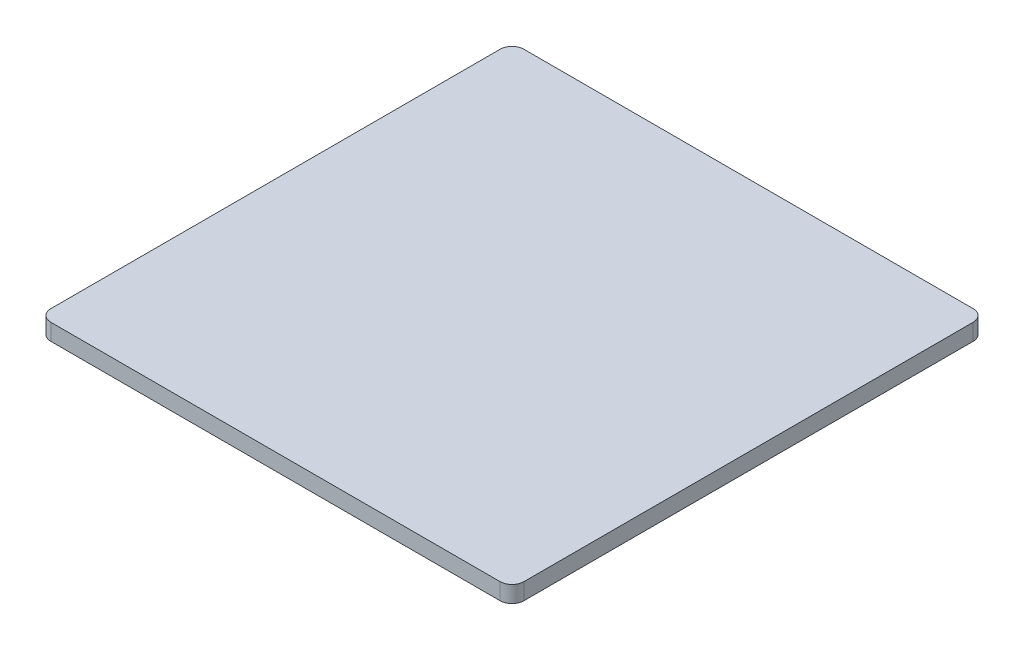
ISO-10303-21;
HEADER;
FILE_DESCRIPTION(('STEP AP214'),'2;1');
FILE_NAME('part.step','',(''),(''),'','','');
FILE_SCHEMA(('AUTOMOTIVE_DESIGN { 1 0 10303 214 1 1 1 1 }'));
ENDSEC;
DATA;
#1=APPLICATION_CONTEXT('core data for automotive mechanical design processes');
#2=APPLICATION_PROTOCOL_DEFINITION('international standard','automotive_design',2000,#1);
#3=PRODUCT_CONTEXT('',#1,'mechanical');
#4=PRODUCT('Part','Part','',(#3));
#5=PRODUCT_RELATED_PRODUCT_CATEGORY('part','',(#4));
#6=PRODUCT_DEFINITION_FORMATION('','',#4);
#7=PRODUCT_DEFINITION_CONTEXT('part definition',#1,'design');
#8=PRODUCT_DEFINITION('design','',#6,#7);
#9=PRODUCT_DEFINITION_SHAPE('','',#8);
#10=(LENGTH_UNIT() NAMED_UNIT(*) SI_UNIT(.MILLI.,.METRE.));
#11=(NAMED_UNIT(*) PLANE_ANGLE_UNIT() SI_UNIT($,.RADIAN.));
#12=(NAMED_UNIT(*) SI_UNIT($,.STERADIAN.) SOLID_ANGLE_UNIT());
#13=UNCERTAINTY_MEASURE_WITH_UNIT(LENGTH_MEASURE(1.E-05),#10,'distance_accuracy_value','');
#14=(GEOMETRIC_REPRESENTATION_CONTEXT(3) GLOBAL_UNCERTAINTY_ASSIGNED_CONTEXT((#13)) GLOBAL_UNIT_ASSIGNED_CONTEXT((#10,
#11,#12)) REPRESENTATION_CONTEXT('',''));
#15=CARTESIAN_POINT('',(0.,0.,0.));
#16=DIRECTION('',(0.,0.,1.));
#17=DIRECTION('',(1.,0.,0.));
#18=AXIS2_PLACEMENT_3D('',#15,#16,#17);
#19=CARTESIAN_POINT('',(9.5,0.,-9.5));
#20=DIRECTION('',(0.,1.,0.));
#21=DIRECTION('',(0.,0.,1.));
#22=AXIS2_PLACEMENT_3D('',#19,#20,#21);
#23=PLANE('',#22);
#24=DIRECTION('',(0.,0.,1.));
#25=VECTOR('',#24,1.);
#26=CARTESIAN_POINT('',(10.,0.,9.5));
#27=LINE('',#26,#25);
#28=CARTESIAN_POINT('',(10.,0.,-9.5));
#29=VERTEX_POINT('',#28);
#30=CARTESIAN_POINT('',(10.,0.,9.5));
#31=VERTEX_POINT('',#30);
#32=EDGE_CURVE('E82',#29,#31,#27,.T.);
#33=ORIENTED_EDGE('',*,*,#32,.T.);
#34=CARTESIAN_POINT('',(9.5,0.,9.5));
#35=DIRECTION('',(0.,-1.,0.));
#36=DIRECTION('',(0.,0.,-1.));
#37=AXIS2_PLACEMENT_3D('',#34,#35,#36);
#38=CIRCLE('',#37,0.5);
#39=CARTESIAN_POINT('',(9.5,0.,10.));
#40=VERTEX_POINT('',#39);
#41=EDGE_CURVE('E105',#40,#31,#38,.F.);
#42=ORIENTED_EDGE('',*,*,#41,.F.);
#43=DIRECTION('',(-1.,0.,0.));
#44=VECTOR('',#43,1.);
#45=CARTESIAN_POINT('',(9.5,0.,10.));
#46=LINE('',#45,#44);
#47=CARTESIAN_POINT('',(-9.5,0.,10.));
#48=VERTEX_POINT('',#47);
#49=EDGE_CURVE('E102',#40,#48,#46,.T.);
#50=ORIENTED_EDGE('',*,*,#49,.T.);
#51=CARTESIAN_POINT('',(-9.5,0.,9.5));
#52=DIRECTION('',(0.,-1.,0.));
#53=DIRECTION('',(0.,0.,-1.));
#54=AXIS2_PLACEMENT_3D('',#51,#52,#53);
#55=CIRCLE('',#54,0.5);
#56=CARTESIAN_POINT('',(-10.,0.,9.5));
#57=VERTEX_POINT('',#56);
#58=EDGE_CURVE('E110',#57,#48,#55,.F.);
#59=ORIENTED_EDGE('',*,*,#58,.F.);
#60=DIRECTION('',(0.,0.,-1.));
#61=VECTOR('',#60,1.);
#62=CARTESIAN_POINT('',(-10.,0.,9.5));
#63=LINE('',#62,#61);
#64=CARTESIAN_POINT('',(-10.,0.,-9.5));
#65=VERTEX_POINT('',#64);
#66=EDGE_CURVE('E107',#57,#65,#63,.T.);
#67=ORIENTED_EDGE('',*,*,#66,.T.);
#68=CARTESIAN_POINT('',(-9.5,0.,-9.5));
#69=DIRECTION('',(0.,-1.,0.));
#70=DIRECTION('',(0.,0.,-1.));
#71=AXIS2_PLACEMENT_3D('',#68,#69,#70);
#72=CIRCLE('',#71,0.5);
#73=CARTESIAN_POINT('',(-9.5,0.,-10.));
#74=VERTEX_POINT('',#73);
#75=EDGE_CURVE('E113',#74,#65,#72,.F.);
#76=ORIENTED_EDGE('',*,*,#75,.F.);
#77=DIRECTION('',(1.,0.,0.));
#78=VECTOR('',#77,1.);
#79=CARTESIAN_POINT('',(9.5,0.,-10.));
#80=LINE('',#79,#78);
#81=CARTESIAN_POINT('',(9.5,0.,-10.));
#82=VERTEX_POINT('',#81);
#83=EDGE_CURVE('E84',#74,#82,#80,.T.);
#84=ORIENTED_EDGE('',*,*,#83,.T.);
#85=CARTESIAN_POINT('',(9.5,0.,-9.5));
#86=DIRECTION('',(0.,-1.,0.));
#87=DIRECTION('',(0.,0.,-1.));
#88=AXIS2_PLACEMENT_3D('',#85,#86,#87);
#89=CIRCLE('',#88,0.5);
#90=EDGE_CURVE('E20',#29,#82,#89,.F.);
#91=ORIENTED_EDGE('',*,*,#90,.F.);
#92=EDGE_LOOP('',(#33,#42,#50,#59,#67,#76,#84,#91));
#93=FACE_BOUND('',#92,.T.);
#94=ADVANCED_FACE('F17',(#93),#23,.F.);
#95=CARTESIAN_POINT('',(9.5,0.7,-9.5));
#96=DIRECTION('',(0.,-1.,0.));
#97=DIRECTION('',(0.,0.,-1.));
#98=AXIS2_PLACEMENT_3D('',#95,#96,#97);
#99=CYLINDRICAL_SURFACE('',#98,0.5);
#100=CARTESIAN_POINT('',(9.5,0.7,-9.5));
#101=DIRECTION('',(0.,-1.,0.));
#102=DIRECTION('',(0.,0.,-1.));
#103=AXIS2_PLACEMENT_3D('',#100,#101,#102);
#104=CIRCLE('',#103,0.5);
#105=CARTESIAN_POINT('',(10.,0.7,-9.5));
#106=VERTEX_POINT('',#105);
#107=CARTESIAN_POINT('',(9.5,0.7,-10.));
#108=VERTEX_POINT('',#107);
#109=EDGE_CURVE('E92',#106,#108,#104,.F.);
#110=ORIENTED_EDGE('',*,*,#109,.F.);
#111=DIRECTION('',(0.,1.,0.));
#112=VECTOR('',#111,1.);
#113=CARTESIAN_POINT('',(10.,0.7,-9.5));
#114=LINE('',#113,#112);
#115=EDGE_CURVE('E89',#106,#29,#114,.F.);
#116=ORIENTED_EDGE('',*,*,#115,.T.);
#117=ORIENTED_EDGE('',*,*,#90,.T.);
#118=DIRECTION('',(0.,1.,0.));
#119=VECTOR('',#118,1.);
#120=CARTESIAN_POINT('',(9.5,0.7,-10.));
#121=LINE('',#120,#119);
#122=EDGE_CURVE('E87',#82,#108,#121,.T.);
#123=ORIENTED_EDGE('',*,*,#122,.T.);
#124=EDGE_LOOP('',(#110,#116,#117,#123));
#125=FACE_BOUND('',#124,.T.);
#126=ADVANCED_FACE('F90',(#125),#99,.T.);
#127=CARTESIAN_POINT('',(9.5,0.7,-10.));
#128=DIRECTION('',(0.,0.,1.));
#129=DIRECTION('',(1.,0.,0.));
#130=AXIS2_PLACEMENT_3D('',#127,#128,#129);
#131=PLANE('',#130);
#132=DIRECTION('',(0.,-1.,0.));
#133=VECTOR('',#132,1.);
#134=CARTESIAN_POINT('',(-9.5,0.7,-10.));
#135=LINE('',#134,#133);
#136=CARTESIAN_POINT('',(-9.5,0.7,-10.));
#137=VERTEX_POINT('',#136);
#138=EDGE_CURVE('E127',#137,#74,#135,.T.);
#139=ORIENTED_EDGE('',*,*,#138,.F.);
#140=DIRECTION('',(1.,0.,0.));
#141=VECTOR('',#140,1.);
#142=CARTESIAN_POINT('',(9.5,0.7,-10.));
#143=LINE('',#142,#141);
#144=EDGE_CURVE('E97',#108,#137,#143,.F.);
#145=ORIENTED_EDGE('',*,*,#144,.F.);
#146=ORIENTED_EDGE('',*,*,#122,.F.);
#147=ORIENTED_EDGE('',*,*,#83,.F.);
#148=EDGE_LOOP('',(#139,#145,#146,#147));
#149=FACE_BOUND('',#148,.T.);
#150=ADVANCED_FACE('F215',(#149),#131,.F.);
#151=CARTESIAN_POINT('',(-9.5,0.7,-9.5));
#152=DIRECTION('',(0.,-1.,0.));
#153=DIRECTION('',(0.,0.,-1.));
#154=AXIS2_PLACEMENT_3D('',#151,#152,#153);
#155=CYLINDRICAL_SURFACE('',#154,0.5);
#156=CARTESIAN_POINT('',(-9.5,0.7,-9.5));
#157=DIRECTION('',(0.,-1.,0.));
#158=DIRECTION('',(0.,0.,-1.));
#159=AXIS2_PLACEMENT_3D('',#156,#157,#158);
#160=CIRCLE('',#159,0.5);
#161=CARTESIAN_POINT('',(-10.,0.7,-9.5));
#162=VERTEX_POINT('',#161);
#163=EDGE_CURVE('E121',#137,#162,#160,.F.);
#164=ORIENTED_EDGE('',*,*,#163,.F.);
#165=ORIENTED_EDGE('',*,*,#138,.T.);
#166=ORIENTED_EDGE('',*,*,#75,.T.);
#167=DIRECTION('',(0.,1.,0.));
#168=VECTOR('',#167,1.);
#169=CARTESIAN_POINT('',(-10.,0.7,-9.5));
#170=LINE('',#169,#168);
#171=EDGE_CURVE('E111',#65,#162,#170,.T.);
#172=ORIENTED_EDGE('',*,*,#171,.T.);
#173=EDGE_LOOP('',(#164,#165,#166,#172));
#174=FACE_BOUND('',#173,.T.);
#175=ADVANCED_FACE('F205',(#174),#155,.T.);
#176=CARTESIAN_POINT('',(-10.,0.7,9.5));
#177=DIRECTION('',(1.,0.,0.));
#178=DIRECTION('',(0.,0.,-1.));
#179=AXIS2_PLACEMENT_3D('',#176,#177,#178);
#180=PLANE('',#179);
#181=DIRECTION('',(0.,-1.,0.));
#182=VECTOR('',#181,1.);
#183=CARTESIAN_POINT('',(-10.,0.7,9.5));
#184=LINE('',#183,#182);
#185=CARTESIAN_POINT('',(-10.,0.7,9.5));
#186=VERTEX_POINT('',#185);
#187=EDGE_CURVE('E126',#186,#57,#184,.T.);
#188=ORIENTED_EDGE('',*,*,#187,.F.);
#189=DIRECTION('',(0.,0.,1.));
#190=VECTOR('',#189,1.);
#191=CARTESIAN_POINT('',(-10.,0.7,-9.5));
#192=LINE('',#191,#190);
#193=EDGE_CURVE('E120',#162,#186,#192,.T.);
#194=ORIENTED_EDGE('',*,*,#193,.F.);
#195=ORIENTED_EDGE('',*,*,#171,.F.);
#196=ORIENTED_EDGE('',*,*,#66,.F.);
#197=EDGE_LOOP('',(#188,#194,#195,#196));
#198=FACE_BOUND('',#197,.T.);
#199=ADVANCED_FACE('F195',(#198),#180,.F.);
#200=CARTESIAN_POINT('',(-9.5,0.7,9.5));
#201=DIRECTION('',(0.,-1.,0.));
#202=DIRECTION('',(0.,0.,-1.));
#203=AXIS2_PLACEMENT_3D('',#200,#201,#202);
#204=CYLINDRICAL_SURFACE('',#203,0.5);
#205=CARTESIAN_POINT('',(-9.5,0.7,9.5));
#206=DIRECTION('',(0.,-1.,0.));
#207=DIRECTION('',(0.,0.,-1.));
#208=AXIS2_PLACEMENT_3D('',#205,#206,#207);
#209=CIRCLE('',#208,0.5);
#210=CARTESIAN_POINT('',(-9.5,0.7,10.));
#211=VERTEX_POINT('',#210);
#212=EDGE_CURVE('E117',#186,#211,#209,.F.);
#213=ORIENTED_EDGE('',*,*,#212,.F.);
#214=ORIENTED_EDGE('',*,*,#187,.T.);
#215=ORIENTED_EDGE('',*,*,#58,.T.);
#216=DIRECTION('',(0.,1.,0.));
#217=VECTOR('',#216,1.);
#218=CARTESIAN_POINT('',(-9.5,0.7,10.));
#219=LINE('',#218,#217);
#220=EDGE_CURVE('E106',#48,#211,#219,.T.);
#221=ORIENTED_EDGE('',*,*,#220,.T.);
#222=EDGE_LOOP('',(#213,#214,#215,#221));
#223=FACE_BOUND('',#222,.T.);
#224=ADVANCED_FACE('F161',(#223),#204,.T.);
#225=CARTESIAN_POINT('',(9.5,0.7,10.));
#226=DIRECTION('',(0.,0.,-1.));
#227=DIRECTION('',(-1.,0.,0.));
#228=AXIS2_PLACEMENT_3D('',#225,#226,#227);
#229=PLANE('',#228);
#230=DIRECTION('',(0.,-1.,0.));
#231=VECTOR('',#230,1.);
#232=CARTESIAN_POINT('',(9.5,0.7,10.));
#233=LINE('',#232,#231);
#234=CARTESIAN_POINT('',(9.5,0.7,10.));
#235=VERTEX_POINT('',#234);
#236=EDGE_CURVE('E125',#235,#40,#233,.T.);
#237=ORIENTED_EDGE('',*,*,#236,.F.);
#238=DIRECTION('',(1.,0.,0.));
#239=VECTOR('',#238,1.);
#240=CARTESIAN_POINT('',(9.5,0.7,10.));
#241=LINE('',#240,#239);
#242=EDGE_CURVE('E116',#211,#235,#241,.T.);
#243=ORIENTED_EDGE('',*,*,#242,.F.);
#244=ORIENTED_EDGE('',*,*,#220,.F.);
#245=ORIENTED_EDGE('',*,*,#49,.F.);
#246=EDGE_LOOP('',(#237,#243,#244,#245));
#247=FACE_BOUND('',#246,.T.);
#248=ADVANCED_FACE('F150',(#247),#229,.F.);
#249=CARTESIAN_POINT('',(9.5,0.7,9.5));
#250=DIRECTION('',(0.,-1.,0.));
#251=DIRECTION('',(0.,0.,-1.));
#252=AXIS2_PLACEMENT_3D('',#249,#250,#251);
#253=CYLINDRICAL_SURFACE('',#252,0.5);
#254=CARTESIAN_POINT('',(9.5,0.7,9.5));
#255=DIRECTION('',(0.,-1.,0.));
#256=DIRECTION('',(0.,0.,-1.));
#257=AXIS2_PLACEMENT_3D('',#254,#255,#256);
#258=CIRCLE('',#257,0.5);
#259=CARTESIAN_POINT('',(10.,0.7,9.5));
#260=VERTEX_POINT('',#259);
#261=EDGE_CURVE('E26',#235,#260,#258,.F.);
#262=ORIENTED_EDGE('',*,*,#261,.F.);
#263=ORIENTED_EDGE('',*,*,#236,.T.);
#264=ORIENTED_EDGE('',*,*,#41,.T.);
#265=DIRECTION('',(0.,1.,0.));
#266=VECTOR('',#265,1.);
#267=CARTESIAN_POINT('',(10.,0.7,9.5));
#268=LINE('',#267,#266);
#269=EDGE_CURVE('E35',#31,#260,#268,.T.);
#270=ORIENTED_EDGE('',*,*,#269,.T.);
#271=EDGE_LOOP('',(#262,#263,#264,#270));
#272=FACE_BOUND('',#271,.T.);
#273=ADVANCED_FACE('F152',(#272),#253,.T.);
#274=CARTESIAN_POINT('',(10.,0.7,9.5));
#275=DIRECTION('',(-1.,0.,0.));
#276=DIRECTION('',(0.,0.,1.));
#277=AXIS2_PLACEMENT_3D('',#274,#275,#276);
#278=PLANE('',#277);
#279=ORIENTED_EDGE('',*,*,#115,.F.);
#280=DIRECTION('',(0.,0.,1.));
#281=VECTOR('',#280,1.);
#282=CARTESIAN_POINT('',(10.,0.7,-9.5));
#283=LINE('',#282,#281);
#284=EDGE_CURVE('E11',#260,#106,#283,.F.);
#285=ORIENTED_EDGE('',*,*,#284,.F.);
#286=ORIENTED_EDGE('',*,*,#269,.F.);
#287=ORIENTED_EDGE('',*,*,#32,.F.);
#288=EDGE_LOOP('',(#279,#285,#286,#287));
#289=FACE_BOUND('',#288,.T.);
#290=ADVANCED_FACE('F95',(#289),#278,.F.);
#291=CARTESIAN_POINT('',(9.5,0.7,-9.5));
#292=DIRECTION('',(0.,1.,0.));
#293=DIRECTION('',(0.,0.,1.));
#294=AXIS2_PLACEMENT_3D('',#291,#292,#293);
#295=PLANE('',#294);
#296=ORIENTED_EDGE('',*,*,#261,.T.);
#297=ORIENTED_EDGE('',*,*,#284,.T.);
#298=ORIENTED_EDGE('',*,*,#109,.T.);
#299=ORIENTED_EDGE('',*,*,#144,.T.);
#300=ORIENTED_EDGE('',*,*,#163,.T.);
#301=ORIENTED_EDGE('',*,*,#193,.T.);
#302=ORIENTED_EDGE('',*,*,#212,.T.);
#303=ORIENTED_EDGE('',*,*,#242,.T.);
#304=EDGE_LOOP('',(#296,#297,#298,#299,#300,#301,#302,#303));
#305=FACE_BOUND('',#304,.T.);
#306=ADVANCED_FACE('F146',(#305),#295,.T.);
#307=CLOSED_SHELL('',(#94,#126,#150,#175,#199,#224,#248,#273,#290,#306));
#308=MANIFOLD_SOLID_BREP('B1',#307);
#309=ADVANCED_BREP_SHAPE_REPRESENTATION('',(#18,#308),#14);
#310=SHAPE_DEFINITION_REPRESENTATION(#9,#309);
ENDSEC;
END-ISO-10303-21;
